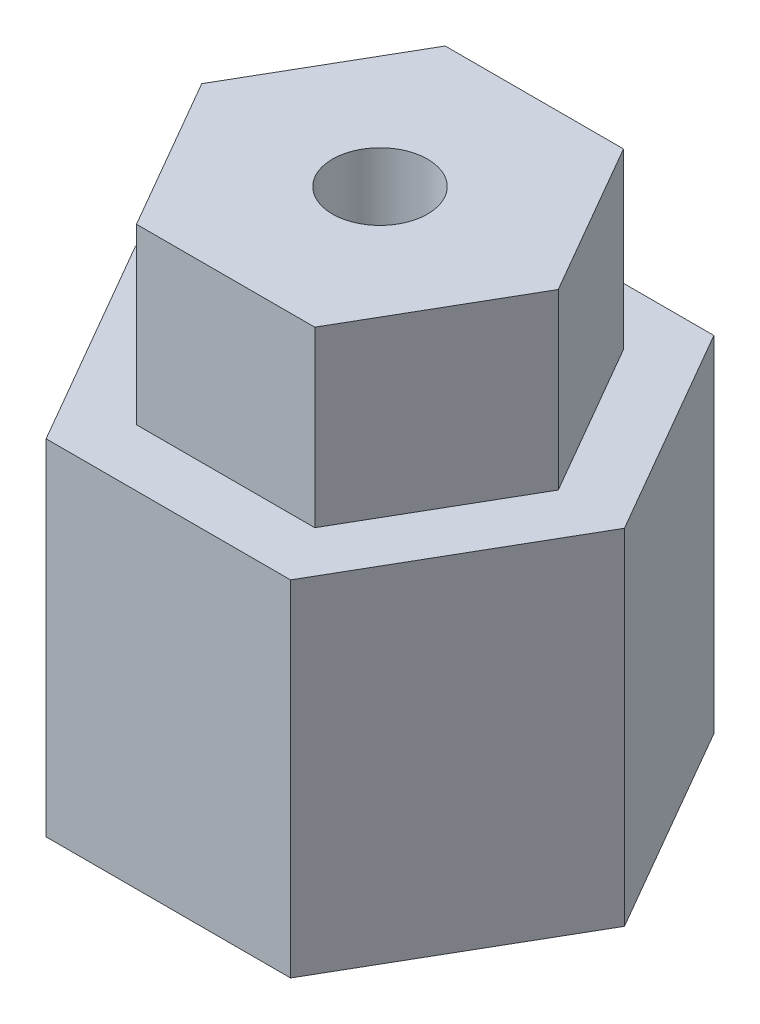
ISO-10303-21;
HEADER;
FILE_DESCRIPTION(('STEP AP214'),'2;1');
FILE_NAME('part.step','',(''),(''),'','','');
FILE_SCHEMA(('AUTOMOTIVE_DESIGN { 1 0 10303 214 1 1 1 1 }'));
ENDSEC;
DATA;
#1=APPLICATION_CONTEXT('core data for automotive mechanical design processes');
#2=APPLICATION_PROTOCOL_DEFINITION('international standard','automotive_design',2000,#1);
#3=PRODUCT_CONTEXT('',#1,'mechanical');
#4=PRODUCT('Part','Part','',(#3));
#5=PRODUCT_RELATED_PRODUCT_CATEGORY('part','',(#4));
#6=PRODUCT_DEFINITION_FORMATION('','',#4);
#7=PRODUCT_DEFINITION_CONTEXT('part definition',#1,'design');
#8=PRODUCT_DEFINITION('design','',#6,#7);
#9=PRODUCT_DEFINITION_SHAPE('','',#8);
#10=(LENGTH_UNIT() NAMED_UNIT(*) SI_UNIT(.MILLI.,.METRE.));
#11=(NAMED_UNIT(*) PLANE_ANGLE_UNIT() SI_UNIT($,.RADIAN.));
#12=(NAMED_UNIT(*) SI_UNIT($,.STERADIAN.) SOLID_ANGLE_UNIT());
#13=UNCERTAINTY_MEASURE_WITH_UNIT(LENGTH_MEASURE(1.E-05),#10,'distance_accuracy_value','');
#14=(GEOMETRIC_REPRESENTATION_CONTEXT(3) GLOBAL_UNCERTAINTY_ASSIGNED_CONTEXT((#13)) GLOBAL_UNIT_ASSIGNED_CONTEXT((#10,
#11,#12)) REPRESENTATION_CONTEXT('',''));
#15=CARTESIAN_POINT('',(0.,0.,0.));
#16=DIRECTION('',(0.,0.,1.));
#17=DIRECTION('',(1.,0.,0.));
#18=AXIS2_PLACEMENT_3D('',#15,#16,#17);
#19=CARTESIAN_POINT('',(0.,18.6325901807805,0.));
#20=DIRECTION('',(0.,-1.,0.));
#21=DIRECTION('',(0.,0.,-1.));
#22=AXIS2_PLACEMENT_3D('',#19,#20,#21);
#23=CYLINDRICAL_SURFACE('',#22,1.85);
#24=CARTESIAN_POINT('',(0.,20.15,0.));
#25=DIRECTION('',(0.,1.,0.));
#26=DIRECTION('',(0.,0.,1.));
#27=AXIS2_PLACEMENT_3D('',#24,#25,#26);
#28=CIRCLE('',#27,1.85);
#29=CARTESIAN_POINT('',(0.,20.15,1.85));
#30=VERTEX_POINT('',#29);
#31=EDGE_CURVE('E414',#30,#30,#28,.T.);
#32=ORIENTED_EDGE('',*,*,#31,.T.);
#33=EDGE_LOOP('',(#32));
#34=FACE_BOUND('',#33,.T.);
#35=CARTESIAN_POINT('',(0.,6.25,0.));
#36=DIRECTION('',(0.,-1.,0.));
#37=DIRECTION('',(0.,0.,-1.));
#38=AXIS2_PLACEMENT_3D('',#35,#36,#37);
#39=CIRCLE('',#38,1.85);
#40=CARTESIAN_POINT('',(0.,6.25,-1.85));
#41=VERTEX_POINT('',#40);
#42=EDGE_CURVE('E49',#41,#41,#39,.F.);
#43=ORIENTED_EDGE('',*,*,#42,.F.);
#44=EDGE_LOOP('',(#43));
#45=FACE_BOUND('',#44,.T.);
#46=ADVANCED_FACE('F45',(#34,#45),#23,.F.);
#47=CARTESIAN_POINT('',(4.75,13.4,8.22724133595217));
#48=DIRECTION('',(-0.866025403784439,0.,-0.5));
#49=DIRECTION('',(-0.5,0.,0.866025403784439));
#50=AXIS2_PLACEMENT_3D('',#47,#48,#49);
#51=PLANE('',#50);
#52=DIRECTION('',(0.5,0.,-0.866025403784439));
#53=VECTOR('',#52,1.);
#54=CARTESIAN_POINT('',(4.75,0.,8.22724133595217));
#55=LINE('',#54,#53);
#56=CARTESIAN_POINT('',(4.75,0.,8.22724133595217));
#57=VERTEX_POINT('',#56);
#58=CARTESIAN_POINT('',(9.5,0.,0.));
#59=VERTEX_POINT('',#58);
#60=EDGE_CURVE('E172',#57,#59,#55,.T.);
#61=ORIENTED_EDGE('',*,*,#60,.T.);
#62=DIRECTION('',(0.,-1.,0.));
#63=VECTOR('',#62,1.);
#64=CARTESIAN_POINT('',(9.5,13.4,0.));
#65=LINE('',#64,#63);
#66=CARTESIAN_POINT('',(9.5,13.4,0.));
#67=VERTEX_POINT('',#66);
#68=EDGE_CURVE('E11',#67,#59,#65,.T.);
#69=ORIENTED_EDGE('',*,*,#68,.F.);
#70=DIRECTION('',(0.5,0.,-0.866025403784439));
#71=VECTOR('',#70,1.);
#72=CARTESIAN_POINT('',(4.75,13.4,8.22724133595217));
#73=LINE('',#72,#71);
#74=CARTESIAN_POINT('',(4.75,13.4,8.22724133595217));
#75=VERTEX_POINT('',#74);
#76=EDGE_CURVE('E174',#75,#67,#73,.T.);
#77=ORIENTED_EDGE('',*,*,#76,.F.);
#78=DIRECTION('',(0.,-1.,0.));
#79=VECTOR('',#78,1.);
#80=CARTESIAN_POINT('',(4.75,13.4,8.22724133595217));
#81=LINE('',#80,#79);
#82=EDGE_CURVE('E194',#75,#57,#81,.T.);
#83=ORIENTED_EDGE('',*,*,#82,.T.);
#84=EDGE_LOOP('',(#61,#69,#77,#83));
#85=FACE_BOUND('',#84,.T.);
#86=ADVANCED_FACE('F47',(#85),#51,.F.);
#87=CARTESIAN_POINT('',(9.5,13.4,0.));
#88=DIRECTION('',(-0.866025403784438,0.,0.5));
#89=DIRECTION('',(0.5,0.,0.866025403784439));
#90=AXIS2_PLACEMENT_3D('',#87,#88,#89);
#91=PLANE('',#90);
#92=DIRECTION('',(-0.5,0.,-0.866025403784438));
#93=VECTOR('',#92,1.);
#94=CARTESIAN_POINT('',(9.5,0.,0.));
#95=LINE('',#94,#93);
#96=CARTESIAN_POINT('',(4.75,0.,-8.22724133595217));
#97=VERTEX_POINT('',#96);
#98=EDGE_CURVE('E198',#59,#97,#95,.T.);
#99=ORIENTED_EDGE('',*,*,#98,.T.);
#100=DIRECTION('',(0.,-1.,0.));
#101=VECTOR('',#100,1.);
#102=CARTESIAN_POINT('',(4.75,13.4,-8.22724133595217));
#103=LINE('',#102,#101);
#104=CARTESIAN_POINT('',(4.75,13.4,-8.22724133595217));
#105=VERTEX_POINT('',#104);
#106=EDGE_CURVE('E55',#105,#97,#103,.T.);
#107=ORIENTED_EDGE('',*,*,#106,.F.);
#108=DIRECTION('',(-0.5,0.,-0.866025403784438));
#109=VECTOR('',#108,1.);
#110=CARTESIAN_POINT('',(9.5,13.4,0.));
#111=LINE('',#110,#109);
#112=EDGE_CURVE('E178',#67,#105,#111,.T.);
#113=ORIENTED_EDGE('',*,*,#112,.F.);
#114=ORIENTED_EDGE('',*,*,#68,.T.);
#115=EDGE_LOOP('',(#99,#107,#113,#114));
#116=FACE_BOUND('',#115,.T.);
#117=ADVANCED_FACE('F256',(#116),#91,.F.);
#118=CARTESIAN_POINT('',(4.75,13.4,-8.22724133595217));
#119=DIRECTION('',(0.,0.,1.));
#120=DIRECTION('',(1.,0.,0.));
#121=AXIS2_PLACEMENT_3D('',#118,#119,#120);
#122=PLANE('',#121);
#123=DIRECTION('',(-1.,0.,0.));
#124=VECTOR('',#123,1.);
#125=CARTESIAN_POINT('',(4.75,0.,-8.22724133595217));
#126=LINE('',#125,#124);
#127=CARTESIAN_POINT('',(-4.75,0.,-8.22724133595217));
#128=VERTEX_POINT('',#127);
#129=EDGE_CURVE('E201',#97,#128,#126,.T.);
#130=ORIENTED_EDGE('',*,*,#129,.T.);
#131=DIRECTION('',(0.,-1.,0.));
#132=VECTOR('',#131,1.);
#133=CARTESIAN_POINT('',(-4.75,13.4,-8.22724133595217));
#134=LINE('',#133,#132);
#135=CARTESIAN_POINT('',(-4.75,13.4,-8.22724133595217));
#136=VERTEX_POINT('',#135);
#137=EDGE_CURVE('E223',#136,#128,#134,.T.);
#138=ORIENTED_EDGE('',*,*,#137,.F.);
#139=DIRECTION('',(-1.,0.,0.));
#140=VECTOR('',#139,1.);
#141=CARTESIAN_POINT('',(4.75,13.4,-8.22724133595217));
#142=LINE('',#141,#140);
#143=EDGE_CURVE('E182',#105,#136,#142,.T.);
#144=ORIENTED_EDGE('',*,*,#143,.F.);
#145=ORIENTED_EDGE('',*,*,#106,.T.);
#146=EDGE_LOOP('',(#130,#138,#144,#145));
#147=FACE_BOUND('',#146,.T.);
#148=ADVANCED_FACE('F233',(#147),#122,.F.);
#149=CARTESIAN_POINT('',(-4.75,13.4,-8.22724133595217));
#150=DIRECTION('',(0.866025403784439,0.,0.5));
#151=DIRECTION('',(0.5,0.,-0.866025403784439));
#152=AXIS2_PLACEMENT_3D('',#149,#150,#151);
#153=PLANE('',#152);
#154=DIRECTION('',(-0.5,0.,0.866025403784439));
#155=VECTOR('',#154,1.);
#156=CARTESIAN_POINT('',(-4.75,0.,-8.22724133595217));
#157=LINE('',#156,#155);
#158=CARTESIAN_POINT('',(-9.5,0.,0.));
#159=VERTEX_POINT('',#158);
#160=EDGE_CURVE('E204',#128,#159,#157,.T.);
#161=ORIENTED_EDGE('',*,*,#160,.T.);
#162=DIRECTION('',(0.,-1.,0.));
#163=VECTOR('',#162,1.);
#164=CARTESIAN_POINT('',(-9.5,13.4,0.));
#165=LINE('',#164,#163);
#166=CARTESIAN_POINT('',(-9.5,13.4,0.));
#167=VERTEX_POINT('',#166);
#168=EDGE_CURVE('E219',#167,#159,#165,.T.);
#169=ORIENTED_EDGE('',*,*,#168,.F.);
#170=DIRECTION('',(-0.5,0.,0.866025403784439));
#171=VECTOR('',#170,1.);
#172=CARTESIAN_POINT('',(-4.75,13.4,-8.22724133595217));
#173=LINE('',#172,#171);
#174=EDGE_CURVE('E185',#136,#167,#173,.T.);
#175=ORIENTED_EDGE('',*,*,#174,.F.);
#176=ORIENTED_EDGE('',*,*,#137,.T.);
#177=EDGE_LOOP('',(#161,#169,#175,#176));
#178=FACE_BOUND('',#177,.T.);
#179=ADVANCED_FACE('F244',(#178),#153,.F.);
#180=CARTESIAN_POINT('',(-9.5,13.4,0.));
#181=DIRECTION('',(0.866025403784439,0.,-0.5));
#182=DIRECTION('',(-0.5,0.,-0.866025403784439));
#183=AXIS2_PLACEMENT_3D('',#180,#181,#182);
#184=PLANE('',#183);
#185=DIRECTION('',(0.5,0.,0.866025403784439));
#186=VECTOR('',#185,1.);
#187=CARTESIAN_POINT('',(-9.5,0.,0.));
#188=LINE('',#187,#186);
#189=CARTESIAN_POINT('',(-4.75,0.,8.22724133595217));
#190=VERTEX_POINT('',#189);
#191=EDGE_CURVE('E207',#159,#190,#188,.T.);
#192=ORIENTED_EDGE('',*,*,#191,.T.);
#193=DIRECTION('',(0.,-1.,0.));
#194=VECTOR('',#193,1.);
#195=CARTESIAN_POINT('',(-4.75,13.4,8.22724133595217));
#196=LINE('',#195,#194);
#197=CARTESIAN_POINT('',(-4.75,13.4,8.22724133595217));
#198=VERTEX_POINT('',#197);
#199=EDGE_CURVE('E215',#198,#190,#196,.T.);
#200=ORIENTED_EDGE('',*,*,#199,.F.);
#201=DIRECTION('',(0.5,0.,0.866025403784439));
#202=VECTOR('',#201,1.);
#203=CARTESIAN_POINT('',(-9.5,13.4,0.));
#204=LINE('',#203,#202);
#205=EDGE_CURVE('E188',#167,#198,#204,.T.);
#206=ORIENTED_EDGE('',*,*,#205,.F.);
#207=ORIENTED_EDGE('',*,*,#168,.T.);
#208=EDGE_LOOP('',(#192,#200,#206,#207));
#209=FACE_BOUND('',#208,.T.);
#210=ADVANCED_FACE('F248',(#209),#184,.F.);
#211=CARTESIAN_POINT('',(-4.75,13.4,8.22724133595217));
#212=DIRECTION('',(0.,0.,-1.));
#213=DIRECTION('',(-1.,0.,0.));
#214=AXIS2_PLACEMENT_3D('',#211,#212,#213);
#215=PLANE('',#214);
#216=DIRECTION('',(1.,0.,0.));
#217=VECTOR('',#216,1.);
#218=CARTESIAN_POINT('',(-4.75,0.,8.22724133595217));
#219=LINE('',#218,#217);
#220=EDGE_CURVE('E179',#190,#57,#219,.T.);
#221=ORIENTED_EDGE('',*,*,#220,.T.);
#222=ORIENTED_EDGE('',*,*,#82,.F.);
#223=DIRECTION('',(1.,0.,0.));
#224=VECTOR('',#223,1.);
#225=CARTESIAN_POINT('',(-4.75,13.4,8.22724133595217));
#226=LINE('',#225,#224);
#227=EDGE_CURVE('E191',#198,#75,#226,.T.);
#228=ORIENTED_EDGE('',*,*,#227,.F.);
#229=ORIENTED_EDGE('',*,*,#199,.T.);
#230=EDGE_LOOP('',(#221,#222,#228,#229));
#231=FACE_BOUND('',#230,.T.);
#232=ADVANCED_FACE('F259',(#231),#215,.F.);
#233=CARTESIAN_POINT('',(0.,13.4,0.));
#234=DIRECTION('',(0.,1.,0.));
#235=DIRECTION('',(0.,0.,1.));
#236=AXIS2_PLACEMENT_3D('',#233,#234,#235);
#237=PLANE('',#236);
#238=DIRECTION('',(0.5,0.,-0.866025403784439));
#239=VECTOR('',#238,1.);
#240=CARTESIAN_POINT('',(3.46410161513775,13.4,6.));
#241=LINE('',#240,#239);
#242=CARTESIAN_POINT('',(3.46410161513775,13.4,6.));
#243=VERTEX_POINT('',#242);
#244=CARTESIAN_POINT('',(6.92820323027551,13.4,0.));
#245=VERTEX_POINT('',#244);
#246=EDGE_CURVE('E62',#243,#245,#241,.T.);
#247=ORIENTED_EDGE('',*,*,#246,.F.);
#248=DIRECTION('',(1.,0.,0.));
#249=VECTOR('',#248,1.);
#250=CARTESIAN_POINT('',(-3.46410161513775,13.4,6.));
#251=LINE('',#250,#249);
#252=CARTESIAN_POINT('',(-3.46410161513775,13.4,6.));
#253=VERTEX_POINT('',#252);
#254=EDGE_CURVE('E66',#253,#243,#251,.T.);
#255=ORIENTED_EDGE('',*,*,#254,.F.);
#256=DIRECTION('',(0.5,0.,0.866025403784439));
#257=VECTOR('',#256,1.);
#258=CARTESIAN_POINT('',(-6.92820323027551,13.4,0.));
#259=LINE('',#258,#257);
#260=CARTESIAN_POINT('',(-6.92820323027551,13.4,0.));
#261=VERTEX_POINT('',#260);
#262=EDGE_CURVE('E441',#261,#253,#259,.T.);
#263=ORIENTED_EDGE('',*,*,#262,.F.);
#264=DIRECTION('',(-0.5,0.,0.866025403784439));
#265=VECTOR('',#264,1.);
#266=CARTESIAN_POINT('',(-3.46410161513775,13.4,-6.));
#267=LINE('',#266,#265);
#268=CARTESIAN_POINT('',(-3.46410161513775,13.4,-6.));
#269=VERTEX_POINT('',#268);
#270=EDGE_CURVE('E437',#269,#261,#267,.T.);
#271=ORIENTED_EDGE('',*,*,#270,.F.);
#272=DIRECTION('',(-1.,0.,0.));
#273=VECTOR('',#272,1.);
#274=CARTESIAN_POINT('',(3.46410161513775,13.4,-6.));
#275=LINE('',#274,#273);
#276=CARTESIAN_POINT('',(3.46410161513775,13.4,-6.));
#277=VERTEX_POINT('',#276);
#278=EDGE_CURVE('E433',#277,#269,#275,.T.);
#279=ORIENTED_EDGE('',*,*,#278,.F.);
#280=DIRECTION('',(-0.5,0.,-0.866025403784438));
#281=VECTOR('',#280,1.);
#282=CARTESIAN_POINT('',(6.92820323027551,13.4,0.));
#283=LINE('',#282,#281);
#284=EDGE_CURVE('E430',#245,#277,#283,.T.);
#285=ORIENTED_EDGE('',*,*,#284,.F.);
#286=EDGE_LOOP('',(#247,#255,#263,#271,#279,#285));
#287=FACE_BOUND('',#286,.T.);
#288=ORIENTED_EDGE('',*,*,#76,.T.);
#289=ORIENTED_EDGE('',*,*,#112,.T.);
#290=ORIENTED_EDGE('',*,*,#143,.T.);
#291=ORIENTED_EDGE('',*,*,#174,.T.);
#292=ORIENTED_EDGE('',*,*,#205,.T.);
#293=ORIENTED_EDGE('',*,*,#227,.T.);
#294=EDGE_LOOP('',(#288,#289,#290,#291,#292,#293));
#295=FACE_BOUND('',#294,.T.);
#296=ADVANCED_FACE('F252',(#287,#295),#237,.T.);
#297=CARTESIAN_POINT('',(0.,0.,0.));
#298=DIRECTION('',(0.,1.,0.));
#299=DIRECTION('',(0.,0.,1.));
#300=AXIS2_PLACEMENT_3D('',#297,#298,#299);
#301=PLANE('',#300);
#302=CARTESIAN_POINT('',(0.,0.,0.));
#303=DIRECTION('',(0.,-1.,0.));
#304=DIRECTION('',(0.,0.,-1.));
#305=AXIS2_PLACEMENT_3D('',#302,#303,#304);
#306=CIRCLE('',#305,6.975);
#307=CARTESIAN_POINT('',(0.,0.,-6.975));
#308=VERTEX_POINT('',#307);
#309=EDGE_CURVE('E159',#308,#308,#306,.T.);
#310=ORIENTED_EDGE('',*,*,#309,.F.);
#311=EDGE_LOOP('',(#310));
#312=FACE_BOUND('',#311,.T.);
#313=ORIENTED_EDGE('',*,*,#60,.F.);
#314=ORIENTED_EDGE('',*,*,#220,.F.);
#315=ORIENTED_EDGE('',*,*,#191,.F.);
#316=ORIENTED_EDGE('',*,*,#160,.F.);
#317=ORIENTED_EDGE('',*,*,#129,.F.);
#318=ORIENTED_EDGE('',*,*,#98,.F.);
#319=EDGE_LOOP('',(#313,#314,#315,#316,#317,#318));
#320=FACE_BOUND('',#319,.T.);
#321=ADVANCED_FACE('F239',(#312,#320),#301,.F.);
#322=CARTESIAN_POINT('',(0.,2.75,0.));
#323=DIRECTION('',(0.,-1.,0.));
#324=DIRECTION('',(0.,0.,-1.));
#325=AXIS2_PLACEMENT_3D('',#322,#323,#324);
#326=CYLINDRICAL_SURFACE('',#325,6.975);
#327=CARTESIAN_POINT('',(0.,2.75,0.));
#328=DIRECTION('',(0.,-1.,0.));
#329=DIRECTION('',(0.,0.,-1.));
#330=AXIS2_PLACEMENT_3D('',#327,#328,#329);
#331=CIRCLE('',#330,6.975);
#332=CARTESIAN_POINT('',(0.,2.75,-6.975));
#333=VERTEX_POINT('',#332);
#334=EDGE_CURVE('E164',#333,#333,#331,.T.);
#335=ORIENTED_EDGE('',*,*,#334,.F.);
#336=EDGE_LOOP('',(#335));
#337=FACE_BOUND('',#336,.T.);
#338=ORIENTED_EDGE('',*,*,#309,.T.);
#339=EDGE_LOOP('',(#338));
#340=FACE_BOUND('',#339,.T.);
#341=ADVANCED_FACE('F285',(#337,#340),#326,.F.);
#342=CARTESIAN_POINT('',(0.,2.75,0.));
#343=DIRECTION('',(0.,-1.,0.));
#344=DIRECTION('',(0.,0.,-1.));
#345=AXIS2_PLACEMENT_3D('',#342,#343,#344);
#346=PLANE('',#345);
#347=CARTESIAN_POINT('',(0.,2.75,0.));
#348=DIRECTION('',(0.,-1.,0.));
#349=DIRECTION('',(0.,0.,-1.));
#350=AXIS2_PLACEMENT_3D('',#347,#348,#349);
#351=CIRCLE('',#350,2.65);
#352=CARTESIAN_POINT('',(0.,2.75,-2.65));
#353=VERTEX_POINT('',#352);
#354=EDGE_CURVE('E408',#353,#353,#351,.T.);
#355=ORIENTED_EDGE('',*,*,#354,.F.);
#356=EDGE_LOOP('',(#355));
#357=FACE_BOUND('',#356,.T.);
#358=ORIENTED_EDGE('',*,*,#334,.T.);
#359=EDGE_LOOP('',(#358));
#360=FACE_BOUND('',#359,.T.);
#361=ADVANCED_FACE('F283',(#357,#360),#346,.T.);
#362=CARTESIAN_POINT('',(0.,20.15,0.));
#363=DIRECTION('',(0.,1.,0.));
#364=DIRECTION('',(0.,0.,1.));
#365=AXIS2_PLACEMENT_3D('',#362,#363,#364);
#366=PLANE('',#365);
#367=ORIENTED_EDGE('',*,*,#31,.F.);
#368=EDGE_LOOP('',(#367));
#369=FACE_BOUND('',#368,.T.);
#370=DIRECTION('',(0.5,0.,-0.866025403784439));
#371=VECTOR('',#370,1.);
#372=CARTESIAN_POINT('',(3.46410161513775,20.15,6.));
#373=LINE('',#372,#371);
#374=CARTESIAN_POINT('',(3.46410161513775,20.15,6.));
#375=VERTEX_POINT('',#374);
#376=CARTESIAN_POINT('',(6.92820323027551,20.15,0.));
#377=VERTEX_POINT('',#376);
#378=EDGE_CURVE('E146',#375,#377,#373,.T.);
#379=ORIENTED_EDGE('',*,*,#378,.T.);
#380=DIRECTION('',(-0.5,0.,-0.866025403784438));
#381=VECTOR('',#380,1.);
#382=CARTESIAN_POINT('',(6.92820323027551,20.15,0.));
#383=LINE('',#382,#381);
#384=CARTESIAN_POINT('',(3.46410161513775,20.15,-6.));
#385=VERTEX_POINT('',#384);
#386=EDGE_CURVE('E134',#377,#385,#383,.T.);
#387=ORIENTED_EDGE('',*,*,#386,.T.);
#388=DIRECTION('',(-1.,0.,0.));
#389=VECTOR('',#388,1.);
#390=CARTESIAN_POINT('',(3.46410161513775,20.15,-6.));
#391=LINE('',#390,#389);
#392=CARTESIAN_POINT('',(-3.46410161513775,20.15,-6.));
#393=VERTEX_POINT('',#392);
#394=EDGE_CURVE('E145',#385,#393,#391,.T.);
#395=ORIENTED_EDGE('',*,*,#394,.T.);
#396=DIRECTION('',(-0.5,0.,0.866025403784439));
#397=VECTOR('',#396,1.);
#398=CARTESIAN_POINT('',(-3.46410161513775,20.15,-6.));
#399=LINE('',#398,#397);
#400=CARTESIAN_POINT('',(-6.92820323027551,20.15,0.));
#401=VERTEX_POINT('',#400);
#402=EDGE_CURVE('E419',#393,#401,#399,.T.);
#403=ORIENTED_EDGE('',*,*,#402,.T.);
#404=DIRECTION('',(0.5,0.,0.866025403784439));
#405=VECTOR('',#404,1.);
#406=CARTESIAN_POINT('',(-6.92820323027551,20.15,0.));
#407=LINE('',#406,#405);
#408=CARTESIAN_POINT('',(-3.46410161513775,20.15,6.));
#409=VERTEX_POINT('',#408);
#410=EDGE_CURVE('E422',#401,#409,#407,.T.);
#411=ORIENTED_EDGE('',*,*,#410,.T.);
#412=DIRECTION('',(1.,0.,0.));
#413=VECTOR('',#412,1.);
#414=CARTESIAN_POINT('',(-3.46410161513775,20.15,6.));
#415=LINE('',#414,#413);
#416=EDGE_CURVE('E151',#409,#375,#415,.T.);
#417=ORIENTED_EDGE('',*,*,#416,.T.);
#418=EDGE_LOOP('',(#379,#387,#395,#403,#411,#417));
#419=FACE_BOUND('',#418,.T.);
#420=ADVANCED_FACE('F149',(#369,#419),#366,.T.);
#421=CARTESIAN_POINT('',(-3.46410161513775,20.15,6.));
#422=DIRECTION('',(0.,0.,-1.));
#423=DIRECTION('',(-1.,0.,0.));
#424=AXIS2_PLACEMENT_3D('',#421,#422,#423);
#425=PLANE('',#424);
#426=ORIENTED_EDGE('',*,*,#254,.T.);
#427=DIRECTION('',(0.,-1.,0.));
#428=VECTOR('',#427,1.);
#429=CARTESIAN_POINT('',(3.46410161513775,20.15,6.));
#430=LINE('',#429,#428);
#431=EDGE_CURVE('E427',#375,#243,#430,.T.);
#432=ORIENTED_EDGE('',*,*,#431,.F.);
#433=ORIENTED_EDGE('',*,*,#416,.F.);
#434=DIRECTION('',(0.,-1.,0.));
#435=VECTOR('',#434,1.);
#436=CARTESIAN_POINT('',(-3.46410161513775,20.15,6.));
#437=LINE('',#436,#435);
#438=EDGE_CURVE('E448',#409,#253,#437,.T.);
#439=ORIENTED_EDGE('',*,*,#438,.T.);
#440=EDGE_LOOP('',(#426,#432,#433,#439));
#441=FACE_BOUND('',#440,.T.);
#442=ADVANCED_FACE('F309',(#441),#425,.F.);
#443=CARTESIAN_POINT('',(-6.92820323027551,20.15,0.));
#444=DIRECTION('',(0.866025403784439,0.,-0.5));
#445=DIRECTION('',(-0.5,0.,-0.866025403784439));
#446=AXIS2_PLACEMENT_3D('',#443,#444,#445);
#447=PLANE('',#446);
#448=ORIENTED_EDGE('',*,*,#262,.T.);
#449=ORIENTED_EDGE('',*,*,#438,.F.);
#450=ORIENTED_EDGE('',*,*,#410,.F.);
#451=DIRECTION('',(0.,-1.,0.));
#452=VECTOR('',#451,1.);
#453=CARTESIAN_POINT('',(-6.92820323027551,20.15,0.));
#454=LINE('',#453,#452);
#455=EDGE_CURVE('E452',#401,#261,#454,.T.);
#456=ORIENTED_EDGE('',*,*,#455,.T.);
#457=EDGE_LOOP('',(#448,#449,#450,#456));
#458=FACE_BOUND('',#457,.T.);
#459=ADVANCED_FACE('F313',(#458),#447,.F.);
#460=CARTESIAN_POINT('',(-3.46410161513775,20.15,-6.));
#461=DIRECTION('',(0.866025403784439,0.,0.5));
#462=DIRECTION('',(0.5,0.,-0.866025403784439));
#463=AXIS2_PLACEMENT_3D('',#460,#461,#462);
#464=PLANE('',#463);
#465=ORIENTED_EDGE('',*,*,#270,.T.);
#466=ORIENTED_EDGE('',*,*,#455,.F.);
#467=ORIENTED_EDGE('',*,*,#402,.F.);
#468=DIRECTION('',(0.,-1.,0.));
#469=VECTOR('',#468,1.);
#470=CARTESIAN_POINT('',(-3.46410161513775,20.15,-6.));
#471=LINE('',#470,#469);
#472=EDGE_CURVE('E166',#393,#269,#471,.T.);
#473=ORIENTED_EDGE('',*,*,#472,.T.);
#474=EDGE_LOOP('',(#465,#466,#467,#473));
#475=FACE_BOUND('',#474,.T.);
#476=ADVANCED_FACE('F323',(#475),#464,.F.);
#477=CARTESIAN_POINT('',(3.46410161513775,20.15,-6.));
#478=DIRECTION('',(0.,0.,1.));
#479=DIRECTION('',(1.,0.,0.));
#480=AXIS2_PLACEMENT_3D('',#477,#478,#479);
#481=PLANE('',#480);
#482=ORIENTED_EDGE('',*,*,#278,.T.);
#483=ORIENTED_EDGE('',*,*,#472,.F.);
#484=ORIENTED_EDGE('',*,*,#394,.F.);
#485=DIRECTION('',(0.,-1.,0.));
#486=VECTOR('',#485,1.);
#487=CARTESIAN_POINT('',(3.46410161513775,20.15,-6.));
#488=LINE('',#487,#486);
#489=EDGE_CURVE('E141',#385,#277,#488,.T.);
#490=ORIENTED_EDGE('',*,*,#489,.T.);
#491=EDGE_LOOP('',(#482,#483,#484,#490));
#492=FACE_BOUND('',#491,.T.);
#493=ADVANCED_FACE('F332',(#492),#481,.F.);
#494=CARTESIAN_POINT('',(6.92820323027551,20.15,0.));
#495=DIRECTION('',(-0.866025403784438,0.,0.5));
#496=DIRECTION('',(0.5,0.,0.866025403784438));
#497=AXIS2_PLACEMENT_3D('',#494,#495,#496);
#498=PLANE('',#497);
#499=ORIENTED_EDGE('',*,*,#284,.T.);
#500=ORIENTED_EDGE('',*,*,#489,.F.);
#501=ORIENTED_EDGE('',*,*,#386,.F.);
#502=DIRECTION('',(0.,-1.,0.));
#503=VECTOR('',#502,1.);
#504=CARTESIAN_POINT('',(6.92820323027551,20.15,0.));
#505=LINE('',#504,#503);
#506=EDGE_CURVE('E139',#377,#245,#505,.T.);
#507=ORIENTED_EDGE('',*,*,#506,.T.);
#508=EDGE_LOOP('',(#499,#500,#501,#507));
#509=FACE_BOUND('',#508,.T.);
#510=ADVANCED_FACE('F137',(#509),#498,.F.);
#511=CARTESIAN_POINT('',(3.46410161513775,20.15,6.));
#512=DIRECTION('',(-0.866025403784439,0.,-0.5));
#513=DIRECTION('',(-0.5,0.,0.866025403784439));
#514=AXIS2_PLACEMENT_3D('',#511,#512,#513);
#515=PLANE('',#514);
#516=ORIENTED_EDGE('',*,*,#246,.T.);
#517=ORIENTED_EDGE('',*,*,#506,.F.);
#518=ORIENTED_EDGE('',*,*,#378,.F.);
#519=ORIENTED_EDGE('',*,*,#431,.T.);
#520=EDGE_LOOP('',(#516,#517,#518,#519));
#521=FACE_BOUND('',#520,.T.);
#522=ADVANCED_FACE('F157',(#521),#515,.F.);
#523=CARTESIAN_POINT('',(0.,6.25,0.));
#524=DIRECTION('',(0.,-1.,0.));
#525=DIRECTION('',(0.,0.,-1.));
#526=AXIS2_PLACEMENT_3D('',#523,#524,#525);
#527=PLANE('',#526);
#528=CARTESIAN_POINT('',(0.,6.25,0.));
#529=DIRECTION('',(0.,-1.,0.));
#530=DIRECTION('',(0.,0.,-1.));
#531=AXIS2_PLACEMENT_3D('',#528,#529,#530);
#532=CIRCLE('',#531,2.65);
#533=CARTESIAN_POINT('',(0.,6.25,-2.65));
#534=VERTEX_POINT('',#533);
#535=EDGE_CURVE('E405',#534,#534,#532,.T.);
#536=ORIENTED_EDGE('',*,*,#535,.T.);
#537=EDGE_LOOP('',(#536));
#538=FACE_BOUND('',#537,.T.);
#539=ORIENTED_EDGE('',*,*,#42,.T.);
#540=EDGE_LOOP('',(#539));
#541=FACE_BOUND('',#540,.T.);
#542=ADVANCED_FACE('F354',(#538,#541),#527,.T.);
#543=CARTESIAN_POINT('',(0.,6.25,0.));
#544=DIRECTION('',(0.,-1.,0.));
#545=DIRECTION('',(0.,0.,-1.));
#546=AXIS2_PLACEMENT_3D('',#543,#544,#545);
#547=CYLINDRICAL_SURFACE('',#546,2.65);
#548=ORIENTED_EDGE('',*,*,#535,.F.);
#549=EDGE_LOOP('',(#548));
#550=FACE_BOUND('',#549,.T.);
#551=ORIENTED_EDGE('',*,*,#354,.T.);
#552=EDGE_LOOP('',(#551));
#553=FACE_BOUND('',#552,.T.);
#554=ADVANCED_FACE('F375',(#550,#553),#547,.F.);
#555=CLOSED_SHELL('',(#46,#86,#117,#148,#179,#210,#232,#296,#321,#341,#361,#420,#442,#459,#476,
#493,#510,#522,#542,#554));
#556=MANIFOLD_SOLID_BREP('B2',#555);
#557=ADVANCED_BREP_SHAPE_REPRESENTATION('',(#18,#556),#14);
#558=SHAPE_DEFINITION_REPRESENTATION(#9,#557);
ENDSEC;
END-ISO-10303-21;
